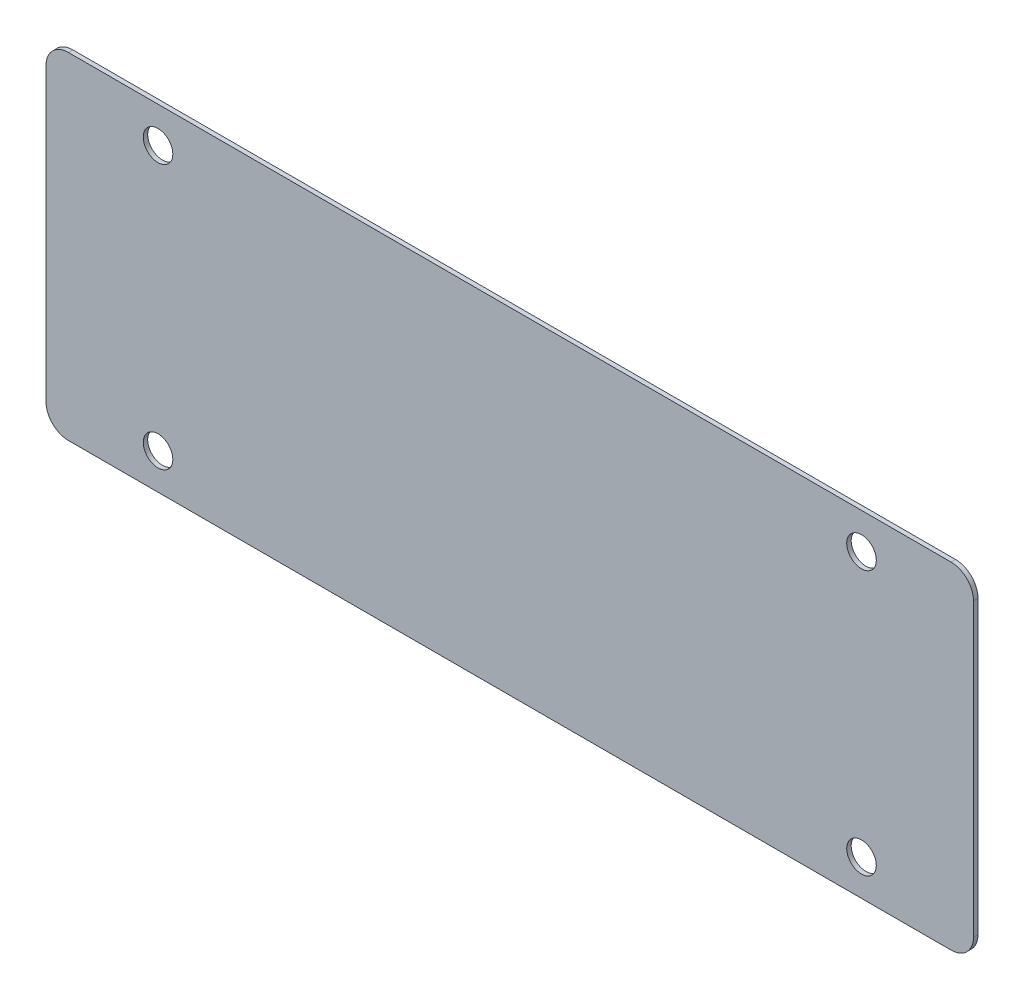
ISO-10303-21;
HEADER;
FILE_DESCRIPTION(('STEP AP214'),'2;1');
FILE_NAME('part.step','',(''),(''),'','','');
FILE_SCHEMA(('AUTOMOTIVE_DESIGN { 1 0 10303 214 1 1 1 1 }'));
ENDSEC;
DATA;
#1=APPLICATION_CONTEXT('core data for automotive mechanical design processes');
#2=APPLICATION_PROTOCOL_DEFINITION('international standard','automotive_design',2000,#1);
#3=PRODUCT_CONTEXT('',#1,'mechanical');
#4=PRODUCT('Part','Part','',(#3));
#5=PRODUCT_RELATED_PRODUCT_CATEGORY('part','',(#4));
#6=PRODUCT_DEFINITION_FORMATION('','',#4);
#7=PRODUCT_DEFINITION_CONTEXT('part definition',#1,'design');
#8=PRODUCT_DEFINITION('design','',#6,#7);
#9=PRODUCT_DEFINITION_SHAPE('','',#8);
#10=(LENGTH_UNIT() NAMED_UNIT(*) SI_UNIT(.MILLI.,.METRE.));
#11=(NAMED_UNIT(*) PLANE_ANGLE_UNIT() SI_UNIT($,.RADIAN.));
#12=(NAMED_UNIT(*) SI_UNIT($,.STERADIAN.) SOLID_ANGLE_UNIT());
#13=UNCERTAINTY_MEASURE_WITH_UNIT(LENGTH_MEASURE(1.E-05),#10,'distance_accuracy_value','');
#14=(GEOMETRIC_REPRESENTATION_CONTEXT(3) GLOBAL_UNCERTAINTY_ASSIGNED_CONTEXT((#13)) GLOBAL_UNIT_ASSIGNED_CONTEXT((#10,
#11,#12)) REPRESENTATION_CONTEXT('',''));
#15=CARTESIAN_POINT('',(0.,0.,0.));
#16=DIRECTION('',(0.,0.,1.));
#17=DIRECTION('',(1.,0.,0.));
#18=AXIS2_PLACEMENT_3D('',#15,#16,#17);
#19=CARTESIAN_POINT('',(103.5,37.5,1.));
#20=DIRECTION('',(-1.,0.,0.));
#21=DIRECTION('',(0.,-1.,0.));
#22=AXIS2_PLACEMENT_3D('',#19,#20,#21);
#23=PLANE('',#22);
#24=DIRECTION('',(0.,1.,0.));
#25=VECTOR('',#24,1.);
#26=CARTESIAN_POINT('',(103.5,37.5,1.));
#27=LINE('',#26,#25);
#28=CARTESIAN_POINT('',(103.5,-32.5,1.));
#29=VERTEX_POINT('',#28);
#30=CARTESIAN_POINT('',(103.5,32.5,1.));
#31=VERTEX_POINT('',#30);
#32=EDGE_CURVE('E133',#29,#31,#27,.T.);
#33=ORIENTED_EDGE('',*,*,#32,.F.);
#34=DIRECTION('',(0.,0.,-1.));
#35=VECTOR('',#34,1.);
#36=CARTESIAN_POINT('',(103.5,-32.5,1.));
#37=LINE('',#36,#35);
#38=CARTESIAN_POINT('',(103.5,-32.5,0.));
#39=VERTEX_POINT('',#38);
#40=EDGE_CURVE('E173',#29,#39,#37,.T.);
#41=ORIENTED_EDGE('',*,*,#40,.T.);
#42=DIRECTION('',(0.,1.,0.));
#43=VECTOR('',#42,1.);
#44=CARTESIAN_POINT('',(103.5,37.5,0.));
#45=LINE('',#44,#43);
#46=CARTESIAN_POINT('',(103.5,32.5,0.));
#47=VERTEX_POINT('',#46);
#48=EDGE_CURVE('E185',#39,#47,#45,.T.);
#49=ORIENTED_EDGE('',*,*,#48,.T.);
#50=DIRECTION('',(0.,0.,-1.));
#51=VECTOR('',#50,1.);
#52=CARTESIAN_POINT('',(103.5,32.5,1.));
#53=LINE('',#52,#51);
#54=EDGE_CURVE('E170',#47,#31,#53,.F.);
#55=ORIENTED_EDGE('',*,*,#54,.T.);
#56=EDGE_LOOP('',(#33,#41,#49,#55));
#57=FACE_BOUND('',#56,.T.);
#58=ADVANCED_FACE('F38',(#57),#23,.F.);
#59=CARTESIAN_POINT('',(-103.5,37.5,1.));
#60=DIRECTION('',(0.,-1.,0.));
#61=DIRECTION('',(0.,0.,-1.));
#62=AXIS2_PLACEMENT_3D('',#59,#60,#61);
#63=PLANE('',#62);
#64=DIRECTION('',(-1.,0.,0.));
#65=VECTOR('',#64,1.);
#66=CARTESIAN_POINT('',(-103.5,37.5,0.));
#67=LINE('',#66,#65);
#68=CARTESIAN_POINT('',(98.4999999999999,37.5,0.));
#69=VERTEX_POINT('',#68);
#70=CARTESIAN_POINT('',(-98.5,37.5,0.));
#71=VERTEX_POINT('',#70);
#72=EDGE_CURVE('E141',#69,#71,#67,.T.);
#73=ORIENTED_EDGE('',*,*,#72,.T.);
#74=DIRECTION('',(0.,0.,-1.));
#75=VECTOR('',#74,1.);
#76=CARTESIAN_POINT('',(-98.5,37.5,1.));
#77=LINE('',#76,#75);
#78=CARTESIAN_POINT('',(-98.5,37.5,1.));
#79=VERTEX_POINT('',#78);
#80=EDGE_CURVE('E11',#71,#79,#77,.F.);
#81=ORIENTED_EDGE('',*,*,#80,.T.);
#82=DIRECTION('',(-1.,0.,0.));
#83=VECTOR('',#82,1.);
#84=CARTESIAN_POINT('',(-103.5,37.5,1.));
#85=LINE('',#84,#83);
#86=CARTESIAN_POINT('',(98.4999999999999,37.5,1.));
#87=VERTEX_POINT('',#86);
#88=EDGE_CURVE('E139',#87,#79,#85,.T.);
#89=ORIENTED_EDGE('',*,*,#88,.F.);
#90=DIRECTION('',(0.,0.,-1.));
#91=VECTOR('',#90,1.);
#92=CARTESIAN_POINT('',(98.5,37.5,1.));
#93=LINE('',#92,#91);
#94=EDGE_CURVE('E47',#87,#69,#93,.T.);
#95=ORIENTED_EDGE('',*,*,#94,.T.);
#96=EDGE_LOOP('',(#73,#81,#89,#95));
#97=FACE_BOUND('',#96,.T.);
#98=ADVANCED_FACE('F181',(#97),#63,.F.);
#99=CARTESIAN_POINT('',(-103.5,37.5,1.));
#100=DIRECTION('',(1.,0.,0.));
#101=DIRECTION('',(0.,0.,-1.));
#102=AXIS2_PLACEMENT_3D('',#99,#100,#101);
#103=PLANE('',#102);
#104=DIRECTION('',(0.,-1.,0.));
#105=VECTOR('',#104,1.);
#106=CARTESIAN_POINT('',(-103.5,37.5,0.));
#107=LINE('',#106,#105);
#108=CARTESIAN_POINT('',(-103.5,32.5,0.));
#109=VERTEX_POINT('',#108);
#110=CARTESIAN_POINT('',(-103.5,-32.5,0.));
#111=VERTEX_POINT('',#110);
#112=EDGE_CURVE('E134',#109,#111,#107,.T.);
#113=ORIENTED_EDGE('',*,*,#112,.T.);
#114=DIRECTION('',(0.,0.,-1.));
#115=VECTOR('',#114,1.);
#116=CARTESIAN_POINT('',(-103.5,-32.5,1.));
#117=LINE('',#116,#115);
#118=CARTESIAN_POINT('',(-103.5,-32.5,1.));
#119=VERTEX_POINT('',#118);
#120=EDGE_CURVE('E109',#111,#119,#117,.F.);
#121=ORIENTED_EDGE('',*,*,#120,.T.);
#122=DIRECTION('',(0.,-1.,0.));
#123=VECTOR('',#122,1.);
#124=CARTESIAN_POINT('',(-103.5,37.5,1.));
#125=LINE('',#124,#123);
#126=CARTESIAN_POINT('',(-103.5,32.5,1.));
#127=VERTEX_POINT('',#126);
#128=EDGE_CURVE('E193',#127,#119,#125,.T.);
#129=ORIENTED_EDGE('',*,*,#128,.F.);
#130=DIRECTION('',(0.,0.,-1.));
#131=VECTOR('',#130,1.);
#132=CARTESIAN_POINT('',(-103.5,32.5,1.));
#133=LINE('',#132,#131);
#134=EDGE_CURVE('E115',#127,#109,#133,.T.);
#135=ORIENTED_EDGE('',*,*,#134,.T.);
#136=EDGE_LOOP('',(#113,#121,#129,#135));
#137=FACE_BOUND('',#136,.T.);
#138=ADVANCED_FACE('F252',(#137),#103,.F.);
#139=CARTESIAN_POINT('',(-103.5,-37.5,1.));
#140=DIRECTION('',(0.,1.,0.));
#141=DIRECTION('',(0.,0.,1.));
#142=AXIS2_PLACEMENT_3D('',#139,#140,#141);
#143=PLANE('',#142);
#144=DIRECTION('',(1.,0.,0.));
#145=VECTOR('',#144,1.);
#146=CARTESIAN_POINT('',(-103.5,-37.5,1.));
#147=LINE('',#146,#145);
#148=CARTESIAN_POINT('',(-98.5,-37.5,1.));
#149=VERTEX_POINT('',#148);
#150=CARTESIAN_POINT('',(98.4999999999999,-37.5,1.));
#151=VERTEX_POINT('',#150);
#152=EDGE_CURVE('E125',#149,#151,#147,.T.);
#153=ORIENTED_EDGE('',*,*,#152,.F.);
#154=DIRECTION('',(0.,0.,-1.));
#155=VECTOR('',#154,1.);
#156=CARTESIAN_POINT('',(-98.5,-37.5,1.));
#157=LINE('',#156,#155);
#158=CARTESIAN_POINT('',(-98.5,-37.5,0.));
#159=VERTEX_POINT('',#158);
#160=EDGE_CURVE('E108',#149,#159,#157,.T.);
#161=ORIENTED_EDGE('',*,*,#160,.T.);
#162=DIRECTION('',(1.,0.,0.));
#163=VECTOR('',#162,1.);
#164=CARTESIAN_POINT('',(-103.5,-37.5,0.));
#165=LINE('',#164,#163);
#166=CARTESIAN_POINT('',(98.4999999999999,-37.5,0.));
#167=VERTEX_POINT('',#166);
#168=EDGE_CURVE('E122',#159,#167,#165,.T.);
#169=ORIENTED_EDGE('',*,*,#168,.T.);
#170=DIRECTION('',(0.,0.,-1.));
#171=VECTOR('',#170,1.);
#172=CARTESIAN_POINT('',(98.5,-37.5,1.));
#173=LINE('',#172,#171);
#174=EDGE_CURVE('E128',#167,#151,#173,.F.);
#175=ORIENTED_EDGE('',*,*,#174,.T.);
#176=EDGE_LOOP('',(#153,#161,#169,#175));
#177=FACE_BOUND('',#176,.T.);
#178=ADVANCED_FACE('F121',(#177),#143,.F.);
#179=CARTESIAN_POINT('',(0.,0.,1.));
#180=DIRECTION('',(0.,0.,1.));
#181=DIRECTION('',(1.,0.,0.));
#182=AXIS2_PLACEMENT_3D('',#179,#180,#181);
#183=PLANE('',#182);
#184=CARTESIAN_POINT('',(78.5,29.5,1.));
#185=DIRECTION('',(0.,0.,1.));
#186=DIRECTION('',(1.,0.,0.));
#187=AXIS2_PLACEMENT_3D('',#184,#185,#186);
#188=CIRCLE('',#187,3.3);
#189=CARTESIAN_POINT('',(81.8,29.5,1.));
#190=VERTEX_POINT('',#189);
#191=EDGE_CURVE('E216',#190,#190,#188,.T.);
#192=ORIENTED_EDGE('',*,*,#191,.F.);
#193=EDGE_LOOP('',(#192));
#194=FACE_BOUND('',#193,.T.);
#195=CARTESIAN_POINT('',(-78.5,-29.5,1.));
#196=DIRECTION('',(0.,0.,1.));
#197=DIRECTION('',(1.,0.,0.));
#198=AXIS2_PLACEMENT_3D('',#195,#196,#197);
#199=CIRCLE('',#198,3.29999999999999);
#200=CARTESIAN_POINT('',(-75.2,-29.5,1.));
#201=VERTEX_POINT('',#200);
#202=EDGE_CURVE('E207',#201,#201,#199,.T.);
#203=ORIENTED_EDGE('',*,*,#202,.F.);
#204=EDGE_LOOP('',(#203));
#205=FACE_BOUND('',#204,.T.);
#206=CARTESIAN_POINT('',(78.5,-29.5,1.));
#207=DIRECTION('',(0.,0.,1.));
#208=DIRECTION('',(1.,0.,0.));
#209=AXIS2_PLACEMENT_3D('',#206,#207,#208);
#210=CIRCLE('',#209,3.3);
#211=CARTESIAN_POINT('',(81.8,-29.5,1.));
#212=VERTEX_POINT('',#211);
#213=EDGE_CURVE('E223',#212,#212,#210,.T.);
#214=ORIENTED_EDGE('',*,*,#213,.F.);
#215=EDGE_LOOP('',(#214));
#216=FACE_BOUND('',#215,.T.);
#217=CARTESIAN_POINT('',(-78.5,29.5,1.));
#218=DIRECTION('',(0.,0.,1.));
#219=DIRECTION('',(1.,0.,0.));
#220=AXIS2_PLACEMENT_3D('',#217,#218,#219);
#221=CIRCLE('',#220,3.29999999999999);
#222=CARTESIAN_POINT('',(-75.2,29.5,1.));
#223=VERTEX_POINT('',#222);
#224=EDGE_CURVE('E199',#223,#223,#221,.T.);
#225=ORIENTED_EDGE('',*,*,#224,.F.);
#226=EDGE_LOOP('',(#225));
#227=FACE_BOUND('',#226,.T.);
#228=ORIENTED_EDGE('',*,*,#128,.T.);
#229=CARTESIAN_POINT('',(-98.5,-32.5,1.));
#230=DIRECTION('',(0.,0.,1.));
#231=DIRECTION('',(1.,0.,0.));
#232=AXIS2_PLACEMENT_3D('',#229,#230,#231);
#233=CIRCLE('',#232,5.);
#234=EDGE_CURVE('E167',#119,#149,#233,.T.);
#235=ORIENTED_EDGE('',*,*,#234,.T.);
#236=ORIENTED_EDGE('',*,*,#152,.T.);
#237=CARTESIAN_POINT('',(98.5,-32.5,1.));
#238=DIRECTION('',(0.,0.,1.));
#239=DIRECTION('',(1.,0.,0.));
#240=AXIS2_PLACEMENT_3D('',#237,#238,#239);
#241=CIRCLE('',#240,5.);
#242=EDGE_CURVE('E164',#151,#29,#241,.T.);
#243=ORIENTED_EDGE('',*,*,#242,.T.);
#244=ORIENTED_EDGE('',*,*,#32,.T.);
#245=CARTESIAN_POINT('',(98.5,32.5,1.));
#246=DIRECTION('',(0.,0.,1.));
#247=DIRECTION('',(1.,0.,0.));
#248=AXIS2_PLACEMENT_3D('',#245,#246,#247);
#249=CIRCLE('',#248,5.);
#250=EDGE_CURVE('E59',#31,#87,#249,.T.);
#251=ORIENTED_EDGE('',*,*,#250,.T.);
#252=ORIENTED_EDGE('',*,*,#88,.T.);
#253=CARTESIAN_POINT('',(-98.5,32.5,1.));
#254=DIRECTION('',(0.,0.,1.));
#255=DIRECTION('',(1.,0.,0.));
#256=AXIS2_PLACEMENT_3D('',#253,#254,#255);
#257=CIRCLE('',#256,5.);
#258=EDGE_CURVE('E161',#79,#127,#257,.T.);
#259=ORIENTED_EDGE('',*,*,#258,.T.);
#260=EDGE_LOOP('',(#228,#235,#236,#243,#244,#251,#252,#259));
#261=FACE_BOUND('',#260,.T.);
#262=ADVANCED_FACE('F242',(#194,#205,#216,#227,#261),#183,.T.);
#263=CARTESIAN_POINT('',(0.,0.,0.));
#264=DIRECTION('',(0.,0.,1.));
#265=DIRECTION('',(1.,0.,0.));
#266=AXIS2_PLACEMENT_3D('',#263,#264,#265);
#267=PLANE('',#266);
#268=CARTESIAN_POINT('',(78.5,29.5,0.));
#269=DIRECTION('',(0.,0.,1.));
#270=DIRECTION('',(1.,0.,0.));
#271=AXIS2_PLACEMENT_3D('',#268,#269,#270);
#272=CIRCLE('',#271,3.3);
#273=CARTESIAN_POINT('',(81.8,29.5,0.));
#274=VERTEX_POINT('',#273);
#275=EDGE_CURVE('E203',#274,#274,#272,.T.);
#276=ORIENTED_EDGE('',*,*,#275,.T.);
#277=EDGE_LOOP('',(#276));
#278=FACE_BOUND('',#277,.T.);
#279=CARTESIAN_POINT('',(-78.5,-29.5,0.));
#280=DIRECTION('',(0.,0.,1.));
#281=DIRECTION('',(1.,0.,0.));
#282=AXIS2_PLACEMENT_3D('',#279,#280,#281);
#283=CIRCLE('',#282,3.29999999999999);
#284=CARTESIAN_POINT('',(-75.2,-29.5,0.));
#285=VERTEX_POINT('',#284);
#286=EDGE_CURVE('E211',#285,#285,#283,.T.);
#287=ORIENTED_EDGE('',*,*,#286,.T.);
#288=EDGE_LOOP('',(#287));
#289=FACE_BOUND('',#288,.T.);
#290=CARTESIAN_POINT('',(78.5,-29.5,0.));
#291=DIRECTION('',(0.,0.,1.));
#292=DIRECTION('',(1.,0.,0.));
#293=AXIS2_PLACEMENT_3D('',#290,#291,#292);
#294=CIRCLE('',#293,3.3);
#295=CARTESIAN_POINT('',(81.8,-29.5,0.));
#296=VERTEX_POINT('',#295);
#297=EDGE_CURVE('E212',#296,#296,#294,.T.);
#298=ORIENTED_EDGE('',*,*,#297,.T.);
#299=EDGE_LOOP('',(#298));
#300=FACE_BOUND('',#299,.T.);
#301=CARTESIAN_POINT('',(-78.5,29.5,0.));
#302=DIRECTION('',(0.,0.,1.));
#303=DIRECTION('',(1.,0.,0.));
#304=AXIS2_PLACEMENT_3D('',#301,#302,#303);
#305=CIRCLE('',#304,3.29999999999999);
#306=CARTESIAN_POINT('',(-75.2,29.5,0.));
#307=VERTEX_POINT('',#306);
#308=EDGE_CURVE('E188',#307,#307,#305,.T.);
#309=ORIENTED_EDGE('',*,*,#308,.T.);
#310=EDGE_LOOP('',(#309));
#311=FACE_BOUND('',#310,.T.);
#312=ORIENTED_EDGE('',*,*,#168,.F.);
#313=CARTESIAN_POINT('',(-98.5,-32.5,0.));
#314=DIRECTION('',(0.,0.,1.));
#315=DIRECTION('',(1.,0.,0.));
#316=AXIS2_PLACEMENT_3D('',#313,#314,#315);
#317=CIRCLE('',#316,5.);
#318=EDGE_CURVE('E104',#159,#111,#317,.F.);
#319=ORIENTED_EDGE('',*,*,#318,.T.);
#320=ORIENTED_EDGE('',*,*,#112,.F.);
#321=CARTESIAN_POINT('',(-98.5,32.5,0.));
#322=DIRECTION('',(0.,0.,1.));
#323=DIRECTION('',(1.,0.,0.));
#324=AXIS2_PLACEMENT_3D('',#321,#322,#323);
#325=CIRCLE('',#324,5.);
#326=EDGE_CURVE('E149',#109,#71,#325,.F.);
#327=ORIENTED_EDGE('',*,*,#326,.T.);
#328=ORIENTED_EDGE('',*,*,#72,.F.);
#329=CARTESIAN_POINT('',(98.5,32.5,0.));
#330=DIRECTION('',(0.,0.,1.));
#331=DIRECTION('',(1.,0.,0.));
#332=AXIS2_PLACEMENT_3D('',#329,#330,#331);
#333=CIRCLE('',#332,5.);
#334=EDGE_CURVE('E127',#69,#47,#333,.F.);
#335=ORIENTED_EDGE('',*,*,#334,.T.);
#336=ORIENTED_EDGE('',*,*,#48,.F.);
#337=CARTESIAN_POINT('',(98.5,-32.5,0.));
#338=DIRECTION('',(0.,0.,1.));
#339=DIRECTION('',(1.,0.,0.));
#340=AXIS2_PLACEMENT_3D('',#337,#338,#339);
#341=CIRCLE('',#340,5.);
#342=EDGE_CURVE('E116',#39,#167,#341,.F.);
#343=ORIENTED_EDGE('',*,*,#342,.T.);
#344=EDGE_LOOP('',(#312,#319,#320,#327,#328,#335,#336,#343));
#345=FACE_BOUND('',#344,.T.);
#346=ADVANCED_FACE('F130',(#278,#289,#300,#311,#345),#267,.F.);
#347=CARTESIAN_POINT('',(-78.5,29.5,0.));
#348=DIRECTION('',(0.,0.,1.));
#349=DIRECTION('',(1.,0.,0.));
#350=AXIS2_PLACEMENT_3D('',#347,#348,#349);
#351=CYLINDRICAL_SURFACE('',#350,3.29999999999999);
#352=ORIENTED_EDGE('',*,*,#308,.F.);
#353=EDGE_LOOP('',(#352));
#354=FACE_BOUND('',#353,.T.);
#355=ORIENTED_EDGE('',*,*,#224,.T.);
#356=EDGE_LOOP('',(#355));
#357=FACE_BOUND('',#356,.T.);
#358=ADVANCED_FACE('F238',(#354,#357),#351,.F.);
#359=CARTESIAN_POINT('',(78.5,-29.5,0.));
#360=DIRECTION('',(0.,0.,1.));
#361=DIRECTION('',(1.,0.,0.));
#362=AXIS2_PLACEMENT_3D('',#359,#360,#361);
#363=CYLINDRICAL_SURFACE('',#362,3.3);
#364=ORIENTED_EDGE('',*,*,#297,.F.);
#365=EDGE_LOOP('',(#364));
#366=FACE_BOUND('',#365,.T.);
#367=ORIENTED_EDGE('',*,*,#213,.T.);
#368=EDGE_LOOP('',(#367));
#369=FACE_BOUND('',#368,.T.);
#370=ADVANCED_FACE('F234',(#366,#369),#363,.F.);
#371=CARTESIAN_POINT('',(-78.5,-29.5,0.));
#372=DIRECTION('',(0.,0.,1.));
#373=DIRECTION('',(1.,0.,0.));
#374=AXIS2_PLACEMENT_3D('',#371,#372,#373);
#375=CYLINDRICAL_SURFACE('',#374,3.29999999999999);
#376=ORIENTED_EDGE('',*,*,#286,.F.);
#377=EDGE_LOOP('',(#376));
#378=FACE_BOUND('',#377,.T.);
#379=ORIENTED_EDGE('',*,*,#202,.T.);
#380=EDGE_LOOP('',(#379));
#381=FACE_BOUND('',#380,.T.);
#382=ADVANCED_FACE('F237',(#378,#381),#375,.F.);
#383=CARTESIAN_POINT('',(78.5,29.5,0.));
#384=DIRECTION('',(0.,0.,1.));
#385=DIRECTION('',(1.,0.,0.));
#386=AXIS2_PLACEMENT_3D('',#383,#384,#385);
#387=CYLINDRICAL_SURFACE('',#386,3.3);
#388=ORIENTED_EDGE('',*,*,#275,.F.);
#389=EDGE_LOOP('',(#388));
#390=FACE_BOUND('',#389,.T.);
#391=ORIENTED_EDGE('',*,*,#191,.T.);
#392=EDGE_LOOP('',(#391));
#393=FACE_BOUND('',#392,.T.);
#394=ADVANCED_FACE('F274',(#390,#393),#387,.F.);
#395=CARTESIAN_POINT('',(-98.5,-32.5,1.));
#396=DIRECTION('',(0.,0.,-1.));
#397=DIRECTION('',(-1.,0.,0.));
#398=AXIS2_PLACEMENT_3D('',#395,#396,#397);
#399=CYLINDRICAL_SURFACE('',#398,5.);
#400=ORIENTED_EDGE('',*,*,#234,.F.);
#401=ORIENTED_EDGE('',*,*,#120,.F.);
#402=ORIENTED_EDGE('',*,*,#318,.F.);
#403=ORIENTED_EDGE('',*,*,#160,.F.);
#404=EDGE_LOOP('',(#400,#401,#402,#403));
#405=FACE_BOUND('',#404,.T.);
#406=ADVANCED_FACE('F107',(#405),#399,.T.);
#407=CARTESIAN_POINT('',(98.5,-32.5,1.));
#408=DIRECTION('',(0.,0.,-1.));
#409=DIRECTION('',(-1.,0.,0.));
#410=AXIS2_PLACEMENT_3D('',#407,#408,#409);
#411=CYLINDRICAL_SURFACE('',#410,5.);
#412=ORIENTED_EDGE('',*,*,#242,.F.);
#413=ORIENTED_EDGE('',*,*,#174,.F.);
#414=ORIENTED_EDGE('',*,*,#342,.F.);
#415=ORIENTED_EDGE('',*,*,#40,.F.);
#416=EDGE_LOOP('',(#412,#413,#414,#415));
#417=FACE_BOUND('',#416,.T.);
#418=ADVANCED_FACE('F256',(#417),#411,.T.);
#419=CARTESIAN_POINT('',(-98.5,32.5,1.));
#420=DIRECTION('',(0.,0.,-1.));
#421=DIRECTION('',(-1.,0.,0.));
#422=AXIS2_PLACEMENT_3D('',#419,#420,#421);
#423=CYLINDRICAL_SURFACE('',#422,5.);
#424=ORIENTED_EDGE('',*,*,#258,.F.);
#425=ORIENTED_EDGE('',*,*,#80,.F.);
#426=ORIENTED_EDGE('',*,*,#326,.F.);
#427=ORIENTED_EDGE('',*,*,#134,.F.);
#428=EDGE_LOOP('',(#424,#425,#426,#427));
#429=FACE_BOUND('',#428,.T.);
#430=ADVANCED_FACE('F254',(#429),#423,.T.);
#431=CARTESIAN_POINT('',(98.5,32.5,1.));
#432=DIRECTION('',(0.,0.,-1.));
#433=DIRECTION('',(-1.,0.,0.));
#434=AXIS2_PLACEMENT_3D('',#431,#432,#433);
#435=CYLINDRICAL_SURFACE('',#434,5.);
#436=ORIENTED_EDGE('',*,*,#250,.F.);
#437=ORIENTED_EDGE('',*,*,#54,.F.);
#438=ORIENTED_EDGE('',*,*,#334,.F.);
#439=ORIENTED_EDGE('',*,*,#94,.F.);
#440=EDGE_LOOP('',(#436,#437,#438,#439));
#441=FACE_BOUND('',#440,.T.);
#442=ADVANCED_FACE('F40',(#441),#435,.T.);
#443=CLOSED_SHELL('',(#58,#98,#138,#178,#262,#346,#358,#370,#382,#394,#406,#418,#430,#442));
#444=MANIFOLD_SOLID_BREP('B2',#443);
#445=ADVANCED_BREP_SHAPE_REPRESENTATION('',(#18,#444),#14);
#446=SHAPE_DEFINITION_REPRESENTATION(#9,#445);
ENDSEC;
END-ISO-10303-21;
